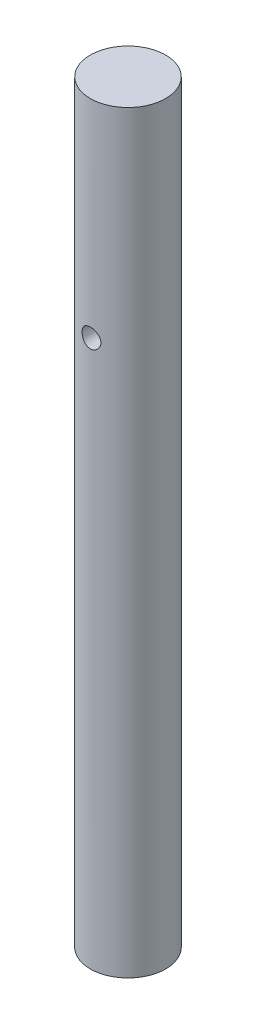
ISO-10303-21;
HEADER;
FILE_DESCRIPTION(('STEP AP214'),'2;1');
FILE_NAME('part.step','',(''),(''),'','','');
FILE_SCHEMA(('AUTOMOTIVE_DESIGN { 1 0 10303 214 1 1 1 1 }'));
ENDSEC;
DATA;
#1=APPLICATION_CONTEXT('core data for automotive mechanical design processes');
#2=APPLICATION_PROTOCOL_DEFINITION('international standard','automotive_design',2000,#1);
#3=PRODUCT_CONTEXT('',#1,'mechanical');
#4=PRODUCT('Part','Part','',(#3));
#5=PRODUCT_RELATED_PRODUCT_CATEGORY('part','',(#4));
#6=PRODUCT_DEFINITION_FORMATION('','',#4);
#7=PRODUCT_DEFINITION_CONTEXT('part definition',#1,'design');
#8=PRODUCT_DEFINITION('design','',#6,#7);
#9=PRODUCT_DEFINITION_SHAPE('','',#8);
#10=(LENGTH_UNIT() NAMED_UNIT(*) SI_UNIT(.MILLI.,.METRE.));
#11=(NAMED_UNIT(*) PLANE_ANGLE_UNIT() SI_UNIT($,.RADIAN.));
#12=(NAMED_UNIT(*) SI_UNIT($,.STERADIAN.) SOLID_ANGLE_UNIT());
#13=UNCERTAINTY_MEASURE_WITH_UNIT(LENGTH_MEASURE(1.E-05),#10,'distance_accuracy_value','');
#14=(GEOMETRIC_REPRESENTATION_CONTEXT(3) GLOBAL_UNCERTAINTY_ASSIGNED_CONTEXT((#13)) GLOBAL_UNIT_ASSIGNED_CONTEXT((#10,
#11,#12)) REPRESENTATION_CONTEXT('',''));
#15=CARTESIAN_POINT('',(0.,0.,0.));
#16=DIRECTION('',(0.,0.,1.));
#17=DIRECTION('',(1.,0.,0.));
#18=AXIS2_PLACEMENT_3D('',#15,#16,#17);
#19=CARTESIAN_POINT('',(0.,800.,0.));
#20=DIRECTION('',(0.,-1.,0.));
#21=DIRECTION('',(0.,0.,-1.));
#22=AXIS2_PLACEMENT_3D('',#19,#20,#21);
#23=CYLINDRICAL_SURFACE('',#22,40.);
#24=CARTESIAN_POINT('',(0.,590.,-40.));
#25=CARTESIAN_POINT('',(-0.276276686131214,589.999998834029,-39.9999993474412));
#26=CARTESIAN_POINT('',(-0.552576783631187,589.988541017278,-39.9971305425548));
#27=CARTESIAN_POINT('',(-1.10318148436562,589.942802754829,-39.9857330256128));
#28=CARTESIAN_POINT('',(-1.3774858563147,589.908519705193,-39.9772036677926));
#29=CARTESIAN_POINT('',(-1.92223360665172,589.817398561938,-39.9547164363919));
#30=CARTESIAN_POINT('',(-2.19267505387195,589.760549569592,-39.9407559397862));
#31=CARTESIAN_POINT('',(-2.72764291200184,589.624766293579,-39.907791142276));
#32=CARTESIAN_POINT('',(-2.99216918887111,589.545831509985,-39.8887867271994));
#33=CARTESIAN_POINT('',(-3.513145285565,589.366621628135,-39.8462801108945));
#34=CARTESIAN_POINT('',(-3.76960471060804,589.26637310496,-39.8227835143951));
#35=CARTESIAN_POINT('',(-4.27306727635454,589.045246902843,-39.7719112039748));
#36=CARTESIAN_POINT('',(-4.52007036697155,588.924369114656,-39.7445354695114));
#37=CARTESIAN_POINT('',(-5.00296312812478,588.662894261255,-39.6866412375216));
#38=CARTESIAN_POINT('',(-5.2388547021167,588.522300589999,-39.6561232811474));
#39=CARTESIAN_POINT('',(-5.69814612012699,588.222310872375,-39.5927379916157));
#40=CARTESIAN_POINT('',(-5.92154144861161,588.062908093187,-39.5598698188549));
#41=CARTESIAN_POINT('',(-6.35826451188653,587.723364111462,-39.4920522419941));
#42=CARTESIAN_POINT('',(-6.57133697514709,587.542899879583,-39.45707594235));
#43=CARTESIAN_POINT('',(-6.98169544574764,587.16476180459,-39.3865370660522));
#44=CARTESIAN_POINT('',(-7.1789742053463,586.967080146287,-39.3509742291619));
#45=CARTESIAN_POINT('',(-7.55636890063759,586.555850880297,-39.2802515251638));
#46=CARTESIAN_POINT('',(-7.73648287233055,586.342301461981,-39.2450917045731));
#47=CARTESIAN_POINT('',(-8.07823801416388,585.900843693481,-39.176172014405));
#48=CARTESIAN_POINT('',(-8.23988747905267,585.672941862732,-39.1424115205899));
#49=CARTESIAN_POINT('',(-8.54601878600914,585.20057500516,-39.0767252483031));
#50=CARTESIAN_POINT('',(-8.69019944369825,584.955909616723,-39.0448355320652));
#51=CARTESIAN_POINT('',(-8.95732951917686,584.45497352556,-38.9844200167823));
#52=CARTESIAN_POINT('',(-9.08028719545706,584.198707386251,-38.9558929106225));
#53=CARTESIAN_POINT('',(-9.30408470665821,583.676244662165,-38.9030492204288));
#54=CARTESIAN_POINT('',(-9.40492284026947,583.410047315376,-38.8787329602996));
#55=CARTESIAN_POINT('',(-9.58363487145947,582.869656183086,-38.8350668183171));
#56=CARTESIAN_POINT('',(-9.66150931910941,582.595462589298,-38.8157168175037));
#57=CARTESIAN_POINT('',(-9.79230027358011,582.046662445358,-38.7829255292181));
#58=CARTESIAN_POINT('',(-9.84568542228694,581.772174161763,-38.7693736587141));
#59=CARTESIAN_POINT('',(-9.92930040805544,581.219470103496,-38.7480433223281));
#60=CARTESIAN_POINT('',(-9.95953052583198,580.941254374053,-38.7402647864543));
#61=CARTESIAN_POINT('',(-9.99656649300492,580.383204676321,-38.7307245693961));
#62=CARTESIAN_POINT('',(-10.0033756681977,580.103370943442,-38.7289620339339));
#63=CARTESIAN_POINT('',(-9.99351800395715,579.544147192337,-38.7315068742112));
#64=CARTESIAN_POINT('',(-9.97685149095118,579.264757167995,-38.7358141655503));
#65=CARTESIAN_POINT('',(-9.92088090803786,578.715269768366,-38.7501861592384));
#66=CARTESIAN_POINT('',(-9.88213622905444,578.445111459601,-38.7601085512958));
#67=CARTESIAN_POINT('',(-9.78276403645947,577.909110496218,-38.7853084477115));
#68=CARTESIAN_POINT('',(-9.72213692994238,577.64326776141,-38.8005858524465));
#69=CARTESIAN_POINT('',(-9.57949942538268,577.117759628676,-38.8360474723497));
#70=CARTESIAN_POINT('',(-9.49749183020054,576.858093425907,-38.8562310443238));
#71=CARTESIAN_POINT('',(-9.31269309254722,576.346544686431,-38.9009354625423));
#72=CARTESIAN_POINT('',(-9.20989415752297,576.094665109064,-38.9254579345653));
#73=CARTESIAN_POINT('',(-8.98318087798946,575.597987061574,-38.9784060382958));
#74=CARTESIAN_POINT('',(-8.85906808208162,575.353283055091,-39.0068678154364));
#75=CARTESIAN_POINT('',(-8.5913353971669,574.875155226747,-39.0667091387545));
#76=CARTESIAN_POINT('',(-8.44771463246079,574.641731911905,-39.0980888158946));
#77=CARTESIAN_POINT('',(-8.14193923712399,574.187619741245,-39.1629064792632));
#78=CARTESIAN_POINT('',(-7.9797822705792,573.9669324957,-39.196344724665));
#79=CARTESIAN_POINT('',(-7.63801932614909,573.539698331601,-39.2643733021678));
#80=CARTESIAN_POINT('',(-7.45841302952054,573.333151671468,-39.2989636553065));
#81=CARTESIAN_POINT('',(-7.07753342014241,572.929806375805,-39.3693672656826));
#82=CARTESIAN_POINT('',(-6.87578778904269,572.73345463454,-39.4051872340633));
#83=CARTESIAN_POINT('',(-6.45639557413324,572.35839703072,-39.4760709124524));
#84=CARTESIAN_POINT('',(-6.2387492495781,572.179690880572,-39.5111346347791));
#85=CARTESIAN_POINT('',(-5.78892992120892,571.841105955039,-39.579540756308));
#86=CARTESIAN_POINT('',(-5.55675333032781,571.681231856995,-39.6128827267264));
#87=CARTESIAN_POINT('',(-5.07955796537568,571.381564063413,-39.6768951897208));
#88=CARTESIAN_POINT('',(-4.83454420385178,571.241762608675,-39.7075667127597));
#89=CARTESIAN_POINT('',(-4.33232990172717,570.982736830804,-39.765500548439));
#90=CARTESIAN_POINT('',(-4.07508804682034,570.863589677737,-39.7927499750226));
#91=CARTESIAN_POINT('',(-3.55104953194878,570.647439944504,-39.842933142722));
#92=CARTESIAN_POINT('',(-3.28425281831394,570.550437488748,-39.8658668595916));
#93=CARTESIAN_POINT('',(-2.74306842511346,570.379392123101,-39.9067562557545));
#94=CARTESIAN_POINT('',(-2.46868193424792,570.305345639808,-39.9247127097788));
#95=CARTESIAN_POINT('',(-1.91431246833759,570.180829515556,-39.9551305553882));
#96=CARTESIAN_POINT('',(-1.63432963144583,570.130359293334,-39.9675920824478));
#97=CARTESIAN_POINT('',(-1.07810473910737,570.054425527534,-39.9864118920525));
#98=CARTESIAN_POINT('',(-0.80195044945145,570.028354803981,-39.9929182716286));
#99=CARTESIAN_POINT('',(-0.248356982178854,569.999242879343,-40.0001867706141));
#100=CARTESIAN_POINT('',(0.0290821734369617,569.996201285376,-40.00094898802));
#101=CARTESIAN_POINT('',(0.583185768536804,570.013172712232,-39.9967080274712));
#102=CARTESIAN_POINT('',(0.859850270347678,570.033183821545,-39.991705327538));
#103=CARTESIAN_POINT('',(1.41040357408712,570.096085253755,-39.9760753561965));
#104=CARTESIAN_POINT('',(1.6842923868641,570.138975487195,-39.9654481067795));
#105=CARTESIAN_POINT('',(2.22327800001193,570.246465877286,-39.9390630903775));
#106=CARTESIAN_POINT('',(2.48844496615141,570.31073407719,-39.9233838802729));
#107=CARTESIAN_POINT('',(3.01234098850958,570.460606222222,-39.8872755198411));
#108=CARTESIAN_POINT('',(3.27107012780193,570.54620989188,-39.8668464308415));
#109=CARTESIAN_POINT('',(3.78033449341554,570.738082991647,-39.8217832029462));
#110=CARTESIAN_POINT('',(4.03087057538308,570.844350255639,-39.7971495048429));
#111=CARTESIAN_POINT('',(4.52223860683232,571.076813406541,-39.7443134144047));
#112=CARTESIAN_POINT('',(4.76306687714373,571.20301676155,-39.7161096855189));
#113=CARTESIAN_POINT('',(5.23752187646098,571.476814439144,-39.6563555782416));
#114=CARTESIAN_POINT('',(5.47094820846407,571.624745122626,-39.624755177931));
#115=CARTESIAN_POINT('',(5.92457828206947,571.939258527777,-39.5594728981749));
#116=CARTESIAN_POINT('',(6.14478145192343,572.105842055074,-39.5257909288532));
#117=CARTESIAN_POINT('',(6.57058731767183,572.456561077056,-39.4572414078492));
#118=CARTESIAN_POINT('',(6.77618804792628,572.640698926949,-39.4223736974844));
#119=CARTESIAN_POINT('',(7.1714528064819,573.025309493713,-39.352389485896));
#120=CARTESIAN_POINT('',(7.36111662432895,573.225782426227,-39.3172729813935));
#121=CARTESIAN_POINT('',(7.72774540600509,573.646906787547,-39.2468808270322));
#122=CARTESIAN_POINT('',(7.9042831534458,573.86793331146,-39.2116225166925));
#123=CARTESIAN_POINT('',(8.23811583861657,574.324316912182,-39.142847392759));
#124=CARTESIAN_POINT('',(8.39541126484785,574.559673624966,-39.1093305349678));
#125=CARTESIAN_POINT('',(8.68966091610267,575.043196551169,-39.0450059331012));
#126=CARTESIAN_POINT('',(8.82661122584507,575.291365217811,-39.0141987109411));
#127=CARTESIAN_POINT('',(9.07904857587192,575.798677033682,-38.9562273945278));
#128=CARTESIAN_POINT('',(9.1945442102564,576.057815737343,-38.9290618427496));
#129=CARTESIAN_POINT('',(9.4026163823082,576.58381347658,-38.879328567111));
#130=CARTESIAN_POINT('',(9.49532212114794,576.850618939403,-38.8567350588003));
#131=CARTESIAN_POINT('',(9.65791512678122,577.39147320057,-38.8166419949047));
#132=CARTESIAN_POINT('',(9.72780242555451,577.665521988763,-38.7991424321806));
#133=CARTESIAN_POINT('',(9.8441460590741,578.218796716723,-38.7697871241357));
#134=CARTESIAN_POINT('',(9.89060669326285,578.498021696757,-38.7579303432304));
#135=CARTESIAN_POINT('',(9.9597017636605,579.059591322185,-38.740232565125));
#136=CARTESIAN_POINT('',(9.9823367731033,579.341935892359,-38.7343914231915));
#137=CARTESIAN_POINT('',(10.0032722204452,579.899447548998,-38.7289898198564));
#138=CARTESIAN_POINT('',(10.0022536208647,580.174587591908,-38.7292536033208));
#139=CARTESIAN_POINT('',(9.97755972226951,580.723776907411,-38.7356226876572));
#140=CARTESIAN_POINT('',(9.9538848817057,580.997826201963,-38.7417278703279));
#141=CARTESIAN_POINT('',(9.8840824840973,581.542852997241,-38.7595950267271));
#142=CARTESIAN_POINT('',(9.83795552407143,581.81383057945,-38.771356850041));
#143=CARTESIAN_POINT('',(9.72363550707294,582.350801016534,-38.8001853309248));
#144=CARTESIAN_POINT('',(9.65544233948358,582.616793846414,-38.8172520150877));
#145=CARTESIAN_POINT('',(9.49803119722785,583.140328204053,-38.8560667748234));
#146=CARTESIAN_POINT('',(9.4089455651017,583.397911755833,-38.8777853112568));
#147=CARTESIAN_POINT('',(9.21017526998103,583.904713754185,-38.9253530530372));
#148=CARTESIAN_POINT('',(9.10048316605145,584.1539291406,-38.9512037499907));
#149=CARTESIAN_POINT('',(8.86133636008451,584.64226545205,-39.0063041604206));
#150=CARTESIAN_POINT('',(8.7318834597438,584.881387294832,-39.0355535639609));
#151=CARTESIAN_POINT('',(8.45410693455427,585.348066951001,-39.0966532023658));
#152=CARTESIAN_POINT('',(8.3057824034957,585.575624208325,-39.1285035621011));
#153=CARTESIAN_POINT('',(7.98715019319338,586.023530819321,-39.1948030871517));
#154=CARTESIAN_POINT('',(7.81637004459896,586.243537368254,-39.2292983680228));
#155=CARTESIAN_POINT('',(7.45713945647239,586.668468963869,-39.2991672194456));
#156=CARTESIAN_POINT('',(7.26868873998238,586.873393774077,-39.3345408037568));
#157=CARTESIAN_POINT('',(6.87530741513618,587.266881073601,-39.4052037523679));
#158=CARTESIAN_POINT('',(6.67037284045594,587.455439602054,-39.4404930942815));
#159=CARTESIAN_POINT('',(6.24539503784921,587.814889147314,-39.5100163411835));
#160=CARTESIAN_POINT('',(6.02535212792859,587.985780535795,-39.5442502683646));
#161=CARTESIAN_POINT('',(5.56740359032032,588.311705186542,-39.6113435460404));
#162=CARTESIAN_POINT('',(5.32924418986217,588.466389716296,-39.6441661227826));
#163=CARTESIAN_POINT('',(4.8404265151646,588.755044537687,-39.7068124330665));
#164=CARTESIAN_POINT('',(4.58977286613402,588.88902242044,-39.7366372641816));
#165=CARTESIAN_POINT('',(4.07773321835856,589.135248391094,-39.7924413064267));
#166=CARTESIAN_POINT('',(3.81635191156582,589.247505858633,-39.8184221763682));
#167=CARTESIAN_POINT('',(3.28463135766318,589.449446743792,-39.8658048489492));
#168=CARTESIAN_POINT('',(3.01429346885352,589.539133566764,-39.8872073422793));
#169=CARTESIAN_POINT('',(2.51829671794581,589.68047406555,-39.9212703038143));
#170=CARTESIAN_POINT('',(2.29382401207507,589.736110394683,-39.9348181936603));
#171=CARTESIAN_POINT('',(1.84138358325462,589.83172183439,-39.9582356855493));
#172=CARTESIAN_POINT('',(1.61341610527136,589.871698037494,-39.9681055441881));
#173=CARTESIAN_POINT('',(1.15510194680524,589.935757826292,-39.9839757782934));
#174=CARTESIAN_POINT('',(0.92475503565459,589.9598398562,-39.9899757749611));
#175=CARTESIAN_POINT('',(0.462944023658243,589.991959343887,-39.9979876402783));
#176=CARTESIAN_POINT('',(0.231480229261548,590.000000976917,-40.0000005467506));
#177=CARTESIAN_POINT('',(0.,590.,-40.));
#178=B_SPLINE_CURVE_WITH_KNOTS('',3,(#24,#25,#26,#27,#28,#29,#30,#31,#32,#33,#34,#35,#36,#37,
#38,#39,#40,#41,#42,#43,#44,#45,#46,#47,#48,#49,#50,#51,#52,#53,#54,#55,#56,#57,#58,#59,#60,#61,
#62,#63,#64,#65,#66,#67,#68,#69,#70,#71,#72,#73,#74,#75,#76,#77,#78,#79,#80,#81,#82,#83,#84,#85,
#86,#87,#88,#89,#90,#91,#92,#93,#94,#95,#96,#97,#98,#99,#100,#101,#102,#103,#104,#105,#106,#107,
#108,#109,#110,#111,#112,#113,#114,#115,#116,#117,#118,#119,#120,#121,#122,#123,#124,#125,#126,
#127,#128,#129,#130,#131,#132,#133,#134,#135,#136,#137,#138,#139,#140,#141,#142,#143,#144,#145,
#146,#147,#148,#149,#150,#151,#152,#153,#154,#155,#156,#157,#158,#159,#160,#161,#162,#163,#164,
#165,#166,#167,#168,#169,#170,#171,#172,#173,#174,#175,#176,#177),.UNSPECIFIED.,.T.,.F.,(4,2,2,
2,2,2,2,2,2,2,2,2,2,2,2,2,2,2,2,2,2,2,2,2,2,2,2,2,2,2,2,2,2,2,2,2,2,2,2,2,2,2,2,2,2,2,2,2,2,2,2,
2,2,2,2,2,2,2,2,2,2,2,2,2,2,2,2,2,2,2,2,2,2,2,2,2,4),(0.,0.828619089346032,1.65733272509385,
2.48644709461138,3.31558023322881,4.14368556550287,4.97179528331478,5.7997626222109,
6.62802724066698,7.47127713116493,8.31491179752409,9.15864287718403,10.0019934272019,
10.8582731380176,11.7142188901354,12.5702304536774,13.4262215106876,14.2650679436647,
15.103904206912,15.9426213496822,16.7813268302768,17.5996711950355,18.4180003363331,
19.2362222532303,20.0547514082784,20.8813618760701,21.7080094621043,22.5347613365454,
23.3615283159286,24.2119083751324,25.0622745723146,25.9128515327318,26.7630988071572,
27.6164573976883,28.4698207823289,29.3230512628312,30.1762607061874,31.0076247471077,
31.8389746047657,32.6702555326213,33.5015332102711,34.320462576117,35.1393813690201,
35.9582143627931,36.7773548236265,37.6108625247906,38.4444062395819,39.2780619461831,
40.1117286598548,40.9659053768096,41.820060404437,42.6743795961244,43.528355831706,
44.3773728438563,45.2263886661149,46.0752486136645,46.9240881375557,47.7485215778695,
48.5729383360593,49.3973331735862,50.2217321438249,51.0410436886271,51.8606516550368,
52.6801849380245,53.4997575896049,54.3407066639188,55.1816689209666,56.0228341380648,
56.8639816554285,57.7205715620531,58.5768466916347,59.432751222229,60.2885265404585,
60.9829517481762,61.6773285006459,62.3717732114253,63.0660371374129),.UNSPECIFIED.);
#179=CARTESIAN_POINT('',(0.,590.,-40.));
#180=VERTEX_POINT('',#179);
#181=EDGE_CURVE('E43',#180,#180,#178,.T.);
#182=ORIENTED_EDGE('',*,*,#181,.T.);
#183=EDGE_LOOP('',(#182));
#184=FACE_BOUND('',#183,.T.);
#185=CARTESIAN_POINT('',(10.,580.,38.7298334620742));
#186=CARTESIAN_POINT('',(9.99999882442997,579.723875269621,38.7298341899213));
#187=CARTESIAN_POINT('',(9.98855350815828,579.44772705279,38.7327944608192));
#188=CARTESIAN_POINT('',(9.94286631560048,578.897430412984,38.7445474128788));
#189=CARTESIAN_POINT('',(9.90862182549979,578.623282222945,38.7533407627742));
#190=CARTESIAN_POINT('',(9.81760607269129,578.07884984096,38.7764982213639));
#191=CARTESIAN_POINT('',(9.76082365272191,577.808567631604,38.7908650891136));
#192=CARTESIAN_POINT('',(9.62520453680396,577.273921714095,38.8247384391517));
#193=CARTESIAN_POINT('',(9.54636729901085,577.009558151524,38.8442450477129));
#194=CARTESIAN_POINT('',(9.36739293650582,576.48892864896,38.887792580226));
#195=CARTESIAN_POINT('',(9.26728433512593,576.232652387848,38.9118274273004));
#196=CARTESIAN_POINT('',(9.04647193519077,575.729541240295,38.963754954298));
#197=CARTESIAN_POINT('',(8.92576802777873,575.482706403765,38.9916476546118));
#198=CARTESIAN_POINT('',(8.66466792990956,575.000121599239,39.0504984131922));
#199=CARTESIAN_POINT('',(8.52427496956356,574.764369821452,39.0814559684059));
#200=CARTESIAN_POINT('',(8.22470570587664,574.305321566924,39.1455959147743));
#201=CARTESIAN_POINT('',(8.06552267426114,574.082029594148,39.1787791010265));
#202=CARTESIAN_POINT('',(7.72620281306206,573.645177958877,39.2471185148684));
#203=CARTESIAN_POINT('',(7.54571867677103,573.431892030132,39.2823005636594));
#204=CARTESIAN_POINT('',(7.1674955643557,573.021103625271,39.3530688746244));
#205=CARTESIAN_POINT('',(6.96974874819936,572.823608399506,39.3886553140078));
#206=CARTESIAN_POINT('',(6.55834550870102,572.445788565421,39.4592404464116));
#207=CARTESIAN_POINT('',(6.34468754181435,572.265465626867,39.4942390820045));
#208=CARTESIAN_POINT('',(5.90296918562836,571.923307200566,39.5626701967293));
#209=CARTESIAN_POINT('',(5.67491535983268,571.76146338083,39.5961033776605));
#210=CARTESIAN_POINT('',(5.20241798527374,571.455103256092,39.6609696857763));
#211=CARTESIAN_POINT('',(4.95778544729489,571.310870624242,39.6923669990285));
#212=CARTESIAN_POINT('',(4.45690914862996,571.043633472307,39.7517235658766));
#213=CARTESIAN_POINT('',(4.200669952289,570.920620697415,39.7796841551814));
#214=CARTESIAN_POINT('',(3.67826123228684,570.696712374437,39.8313856998777));
#215=CARTESIAN_POINT('',(3.41209084633901,570.595818752124,39.8551262878265));
#216=CARTESIAN_POINT('',(2.87176268956707,570.416996497642,39.8976992717744));
#217=CARTESIAN_POINT('',(2.59760510439595,570.339067332158,39.9165317817549));
#218=CARTESIAN_POINT('',(2.04895085371045,570.208180909796,39.9484139035388));
#219=CARTESIAN_POINT('',(1.77457355161674,570.154749784061,39.9615729295541));
#220=CARTESIAN_POINT('',(1.22210094355825,570.071026034696,39.9822820060831));
#221=CARTESIAN_POINT('',(0.944005683045228,570.040733128466,39.9898321251015));
#222=CARTESIAN_POINT('',(0.386193892504603,570.003551672863,39.9991081672612));
#223=CARTESIAN_POINT('',(0.106477575801441,569.996660111011,40.0008348400605));
#224=CARTESIAN_POINT('',(-0.452521768391034,570.006333777652,39.998416740294));
#225=CARTESIAN_POINT('',(-0.731804801218185,570.022898714838,39.9942720406449));
#226=CARTESIAN_POINT('',(-1.28167192331624,570.078710650796,39.9803861278034));
#227=CARTESIAN_POINT('',(-1.55231139511287,570.117445361854,39.9707713435709));
#228=CARTESIAN_POINT('',(-2.08927819575381,570.216878314874,39.9463033354469));
#229=CARTESIAN_POINT('',(-2.35560559929166,570.277576175965,39.9314502023955));
#230=CARTESIAN_POINT('',(-2.88207226755678,570.420436087917,39.8969077325925));
#231=CARTESIAN_POINT('',(-3.14221243703709,570.502594979235,39.8772191077585));
#232=CARTESIAN_POINT('',(-3.65468922534325,570.687776427834,39.8335212464006));
#233=CARTESIAN_POINT('',(-3.90702288413571,570.790806789946,39.8095103939667));
#234=CARTESIAN_POINT('',(-4.40431534757042,571.0179408462,39.7575786675424));
#235=CARTESIAN_POINT('',(-4.64918953968527,571.142222289025,39.7296251936964));
#236=CARTESIAN_POINT('',(-5.1276299458178,571.410319421921,39.6707136012489));
#237=CARTESIAN_POINT('',(-5.36119566090551,571.554135972819,39.6397553502575));
#238=CARTESIAN_POINT('',(-5.81555504064865,571.860320811557,39.5756487313005));
#239=CARTESIAN_POINT('',(-6.03634710089039,572.022691422263,39.5425000893299));
#240=CARTESIAN_POINT('',(-6.46374754042438,572.364889355903,39.4748880854212));
#241=CARTESIAN_POINT('',(-6.67035566703926,572.544716989685,39.4404247000789));
#242=CARTESIAN_POINT('',(-7.07349089831619,572.925770408818,39.3701501734565));
#243=CARTESIAN_POINT('',(-7.26959292932934,573.127444095085,39.3343278217393));
#244=CARTESIAN_POINT('',(-7.64415900384798,573.546641179253,39.2632548591757));
#245=CARTESIAN_POINT('',(-7.82262331948686,573.764164332523,39.228004239515));
#246=CARTESIAN_POINT('',(-8.1607456998875,574.213692980132,39.1590604771079));
#247=CARTESIAN_POINT('',(-8.32039882751899,574.445702252121,39.1253677446435));
#248=CARTESIAN_POINT('',(-8.61965464411434,574.922525158569,39.060529886451));
#249=CARTESIAN_POINT('',(-8.75926505153293,575.167333814169,39.0293837820158));
#250=CARTESIAN_POINT('',(-9.01813008771381,575.669466740345,38.9703868755207));
#251=CARTESIAN_POINT('',(-9.13727778907712,575.926848234477,38.9425536036319));
#252=CARTESIAN_POINT('',(-9.3534096608626,576.451178423362,38.8912082072346));
#253=CARTESIAN_POINT('',(-9.45039369101393,576.718127178653,38.8676961100745));
#254=CARTESIAN_POINT('',(-9.62137978988926,577.259626039938,38.8257235359302));
#255=CARTESIAN_POINT('',(-9.6953858891352,577.534174803615,38.8072621730724));
#256=CARTESIAN_POINT('',(-9.81979727188805,578.088882634275,38.7759681424773));
#257=CARTESIAN_POINT('',(-9.87020317804405,578.369041553042,38.7631353262415));
#258=CARTESIAN_POINT('',(-9.94595070620549,578.925389827174,38.7437678916113));
#259=CARTESIAN_POINT('',(-9.97191943788913,579.20148845672,38.7370758084013));
#260=CARTESIAN_POINT('',(-10.0008373658099,579.754966786012,38.7296201690535));
#261=CARTESIAN_POINT('',(-10.0037869656029,580.032346463215,38.7288565089826));
#262=CARTESIAN_POINT('',(-9.98664204170718,580.586319928274,38.7332810041534));
#263=CARTESIAN_POINT('',(-9.96654947524488,580.862913780878,38.7384686538844));
#264=CARTESIAN_POINT('',(-9.90349851182773,581.413309624554,38.7546355102655));
#265=CARTESIAN_POINT('',(-9.86054021553218,581.687111627911,38.7656146914202));
#266=CARTESIAN_POINT('',(-9.75302617959886,582.225436670251,38.792802095148));
#267=CARTESIAN_POINT('',(-9.68884045543288,582.490038288319,38.808920572734));
#268=CARTESIAN_POINT('',(-9.53919991763378,583.012912140479,38.8459727915572));
#269=CARTESIAN_POINT('',(-9.45373745454552,583.271182061423,38.8669082644045));
#270=CARTESIAN_POINT('',(-9.26222456918992,583.779545952517,38.9129912310831));
#271=CARTESIAN_POINT('',(-9.156176456258,584.029640836083,38.9381382524119));
#272=CARTESIAN_POINT('',(-8.9242616719413,584.520081796427,38.9919442389091));
#273=CARTESIAN_POINT('',(-8.79839403460798,584.760427397335,39.020603375233));
#274=CARTESIAN_POINT('',(-8.52507025703206,585.234451946238,39.0812377810118));
#275=CARTESIAN_POINT('',(-8.37723937262532,585.467907932585,39.1132670320869));
#276=CARTESIAN_POINT('',(-8.06292122077331,585.92161004068,39.1792684975873));
#277=CARTESIAN_POINT('',(-7.8964337599021,586.141856025434,39.213240732155));
#278=CARTESIAN_POINT('',(-7.54588651811454,586.567775929618,39.2822033680952));
#279=CARTESIAN_POINT('',(-7.36182400287637,586.773447572877,39.3171939273078));
#280=CARTESIAN_POINT('',(-6.97734499923084,587.16887046714,39.3872419853854));
#281=CARTESIAN_POINT('',(-6.77692868956994,587.358621892105,39.4222994835148));
#282=CARTESIAN_POINT('',(-6.35575426200214,587.725564756481,39.492418194567));
#283=CARTESIAN_POINT('',(-6.13461012391737,587.902317714946,39.5274571209805));
#284=CARTESIAN_POINT('',(-5.67802548588014,588.23650628064,39.5956219392226));
#285=CARTESIAN_POINT('',(-5.44259023238082,588.393948913588,39.6287485244866));
#286=CARTESIAN_POINT('',(-4.95889198957682,588.688473853361,39.6921766318283));
#287=CARTESIAN_POINT('',(-4.71062694336362,588.8255528817,39.7224776987134));
#288=CARTESIAN_POINT('',(-4.20300973280715,589.078275792786,39.7793907145879));
#289=CARTESIAN_POINT('',(-3.9436577325089,589.193919992552,39.8060027181368));
#290=CARTESIAN_POINT('',(-3.41762467099819,589.40208833476,39.854599371261));
#291=CARTESIAN_POINT('',(-3.15101114925918,589.494775508058,39.8766164648642));
#292=CARTESIAN_POINT('',(-2.61056101580697,589.657359782472,39.9156405917383));
#293=CARTESIAN_POINT('',(-2.33672441895222,589.727256930464,39.9326476353145));
#294=CARTESIAN_POINT('',(-1.78388474605426,589.843654650577,39.9611605112158));
#295=CARTESIAN_POINT('',(-1.50488250857591,589.890158986238,39.9726672284434));
#296=CARTESIAN_POINT('',(-0.943766157460648,589.959378028779,39.9898497386379));
#297=CARTESIAN_POINT('',(-0.661652112184832,589.982093257219,39.9955256594407));
#298=CARTESIAN_POINT('',(-0.104112904575605,590.003242923547,40.0008096434568));
#299=CARTESIAN_POINT('',(0.171286648704951,590.002317857947,40.0005777695811));
#300=CARTESIAN_POINT('',(0.72100471728221,589.977767630316,39.9944459263858));
#301=CARTESIAN_POINT('',(0.995323253299014,589.95414290552,39.9885460662415));
#302=CARTESIAN_POINT('',(1.54089668345798,589.88439505555,39.9712412549094));
#303=CARTESIAN_POINT('',(1.81215168421024,589.838272715769,39.9598364958982));
#304=CARTESIAN_POINT('',(2.3496844415104,589.723913257753,39.9318346598787));
#305=CARTESIAN_POINT('',(2.6159621757557,589.655676040449,39.9152375596099));
#306=CARTESIAN_POINT('',(3.14021575704103,589.498081239422,39.8774088289047));
#307=CARTESIAN_POINT('',(3.39822973487922,589.408844031413,39.8562036638954));
#308=CARTESIAN_POINT('',(3.90587165349159,589.20969788033,39.8096616921238));
#309=CARTESIAN_POINT('',(4.15549652321266,589.099781462185,39.7843233917676));
#310=CARTESIAN_POINT('',(4.64461219621893,588.860120723733,39.7301915510436));
#311=CARTESIAN_POINT('',(4.88410403648992,588.730378438647,39.7013983654015));
#312=CARTESIAN_POINT('',(5.35147219645957,588.451966546248,39.6411058752873));
#313=CARTESIAN_POINT('',(5.57934796737113,588.303296045853,39.6096064431502));
#314=CARTESIAN_POINT('',(6.02736320395832,587.98425435481,39.5439423385718));
#315=CARTESIAN_POINT('',(6.24718667381966,587.81344870947,39.5097319017043));
#316=CARTESIAN_POINT('',(6.67174267648604,587.454205479761,39.4402602733644));
#317=CARTESIAN_POINT('',(6.87647499099677,587.265767640431,39.404999066703));
#318=CARTESIAN_POINT('',(7.26957571543624,586.872451816628,39.3343764033807));
#319=CARTESIAN_POINT('',(7.45793992681896,586.667569639827,39.2990149233869));
#320=CARTESIAN_POINT('',(7.81700480743321,586.242738774985,39.2291715027163));
#321=CARTESIAN_POINT('',(7.98770582400299,586.022790383356,39.1946895447542));
#322=CARTESIAN_POINT('',(8.31334837970532,585.564947074658,39.126927151647));
#323=CARTESIAN_POINT('',(8.46793100988814,585.326791501892,39.0936817514607));
#324=CARTESIAN_POINT('',(8.75638447022772,584.837998523206,39.0300851587657));
#325=CARTESIAN_POINT('',(8.89026288683362,584.587365733907,38.9997329077193));
#326=CARTESIAN_POINT('',(9.13629742054285,584.075377682436,38.942830069642));
#327=CARTESIAN_POINT('',(9.24846310997747,583.814027207159,38.9162778086895));
#328=CARTESIAN_POINT('',(9.45023169430972,583.282367132466,38.8677746224896));
#329=CARTESIAN_POINT('',(9.53983802902283,583.012058906036,38.8458229958303));
#330=CARTESIAN_POINT('',(9.68099536807506,582.516272906672,38.8108560703005));
#331=CARTESIAN_POINT('',(9.7365385871733,582.291985908195,38.7969358503791));
#332=CARTESIAN_POINT('',(9.83199198174686,581.839915757489,38.7728560236366));
#333=CARTESIAN_POINT('',(9.87190326833696,581.612132854945,38.7626961495336));
#334=CARTESIAN_POINT('',(9.93585968093077,581.154187254159,38.746351883518));
#335=CARTESIAN_POINT('',(9.959903386569,580.924024344746,38.7401678474984));
#336=CARTESIAN_POINT('',(9.99197195283625,580.462579578736,38.7319088669302));
#337=CARTESIAN_POINT('',(10.0000009847254,580.231298029244,38.7298328523873));
#338=CARTESIAN_POINT('',(10.,580.,38.7298334620742));
#339=B_SPLINE_CURVE_WITH_KNOTS('',3,(#185,#186,#187,#188,#189,#190,#191,#192,#193,#194,#195,
#196,#197,#198,#199,#200,#201,#202,#203,#204,#205,#206,#207,#208,#209,#210,#211,#212,#213,#214,
#215,#216,#217,#218,#219,#220,#221,#222,#223,#224,#225,#226,#227,#228,#229,#230,#231,#232,#233,
#234,#235,#236,#237,#238,#239,#240,#241,#242,#243,#244,#245,#246,#247,#248,#249,#250,#251,#252,
#253,#254,#255,#256,#257,#258,#259,#260,#261,#262,#263,#264,#265,#266,#267,#268,#269,#270,#271,
#272,#273,#274,#275,#276,#277,#278,#279,#280,#281,#282,#283,#284,#285,#286,#287,#288,#289,#290,
#291,#292,#293,#294,#295,#296,#297,#298,#299,#300,#301,#302,#303,#304,#305,#306,#307,#308,#309,
#310,#311,#312,#313,#314,#315,#316,#317,#318,#319,#320,#321,#322,#323,#324,#325,#326,#327,#328,
#329,#330,#331,#332,#333,#334,#335,#336,#337,#338),.UNSPECIFIED.,.T.,.F.,(4,2,2,2,2,2,2,2,2,2,2,
2,2,2,2,2,2,2,2,2,2,2,2,2,2,2,2,2,2,2,2,2,2,2,2,2,2,2,2,2,2,2,2,2,2,2,2,2,2,2,2,2,2,2,2,2,2,2,2,
2,2,2,2,2,2,2,2,2,2,2,2,2,2,2,2,2,4),(0.,0.828162825376978,1.65642061195399,2.48508893479632,
3.31377761821723,4.1413620257038,4.96895080753393,5.79640397677724,6.62415434115293,
7.46800303009643,8.31223697591952,9.15655292804189,10.0004866733415,10.8565959733453,
11.7123714806967,12.5682214654157,13.4240515727625,14.2625454893965,15.1010291648647,
15.9394048973841,16.7777702181964,17.5975029902135,18.4172215476144,19.2368194921193,
20.056724490713,20.8838566603857,21.7110252899347,22.5382975900666,23.3655846236837,
24.2152966903926,25.0649956447941,25.9149171143109,26.7645103958648,27.6184163805485,
28.4723277693369,29.3260892901699,30.1798282847551,31.0110078576626,31.84217285886,
32.6732672652382,33.5043580130106,34.3216649160701,35.1392660843285,35.9567755855605,
36.7743249422727,37.6078964412196,38.4414765831921,39.2751866252889,40.1088875561811,
40.9636530981616,41.8181067205346,42.6726977588944,43.5272761569089,44.3755994984591,
45.2239210950745,46.0721061662236,46.9202726411622,47.7454843682623,48.5706802006537,
49.3958472274469,50.2210179508398,51.0415691607351,51.8624175534056,52.6831817385655,
53.5039846638633,54.3444458716784,55.1849192344215,56.0256075526297,56.8662793359625,
57.722842795138,58.5790916443919,59.4349621414429,60.2907020575397,60.9845870835283,
61.6784227793473,62.3723205745283,63.0660376100851),.UNSPECIFIED.);
#340=CARTESIAN_POINT('',(10.,580.,38.7298334620742));
#341=VERTEX_POINT('',#340);
#342=EDGE_CURVE('E59',#341,#341,#339,.T.);
#343=ORIENTED_EDGE('',*,*,#342,.T.);
#344=EDGE_LOOP('',(#343));
#345=FACE_BOUND('',#344,.T.);
#346=CARTESIAN_POINT('',(0.,800.,0.));
#347=DIRECTION('',(0.,1.,0.));
#348=DIRECTION('',(0.,0.,1.));
#349=AXIS2_PLACEMENT_3D('',#346,#347,#348);
#350=CIRCLE('',#349,40.);
#351=CARTESIAN_POINT('',(0.,800.,40.));
#352=VERTEX_POINT('',#351);
#353=EDGE_CURVE('E10',#352,#352,#350,.T.);
#354=ORIENTED_EDGE('',*,*,#353,.F.);
#355=EDGE_LOOP('',(#354));
#356=FACE_BOUND('',#355,.T.);
#357=CARTESIAN_POINT('',(0.,0.,0.));
#358=DIRECTION('',(0.,1.,0.));
#359=DIRECTION('',(0.,0.,1.));
#360=AXIS2_PLACEMENT_3D('',#357,#358,#359);
#361=CIRCLE('',#360,40.);
#362=CARTESIAN_POINT('',(0.,0.,40.));
#363=VERTEX_POINT('',#362);
#364=EDGE_CURVE('E52',#363,#363,#361,.T.);
#365=ORIENTED_EDGE('',*,*,#364,.T.);
#366=EDGE_LOOP('',(#365));
#367=FACE_BOUND('',#366,.T.);
#368=ADVANCED_FACE('F39',(#184,#345,#356,#367),#23,.T.);
#369=CARTESIAN_POINT('',(0.,800.,0.));
#370=DIRECTION('',(0.,1.,0.));
#371=DIRECTION('',(0.,0.,1.));
#372=AXIS2_PLACEMENT_3D('',#369,#370,#371);
#373=PLANE('',#372);
#374=ORIENTED_EDGE('',*,*,#353,.T.);
#375=EDGE_LOOP('',(#374));
#376=FACE_BOUND('',#375,.T.);
#377=ADVANCED_FACE('F71',(#376),#373,.T.);
#378=CARTESIAN_POINT('',(0.,0.,0.));
#379=DIRECTION('',(0.,1.,0.));
#380=DIRECTION('',(0.,0.,1.));
#381=AXIS2_PLACEMENT_3D('',#378,#379,#380);
#382=PLANE('',#381);
#383=ORIENTED_EDGE('',*,*,#364,.F.);
#384=EDGE_LOOP('',(#383));
#385=FACE_BOUND('',#384,.T.);
#386=ADVANCED_FACE('F69',(#385),#382,.F.);
#387=CARTESIAN_POINT('',(0.,580.,-400.));
#388=DIRECTION('',(0.,0.,1.));
#389=DIRECTION('',(1.,0.,0.));
#390=AXIS2_PLACEMENT_3D('',#387,#388,#389);
#391=CYLINDRICAL_SURFACE('',#390,10.);
#392=ORIENTED_EDGE('',*,*,#342,.F.);
#393=EDGE_LOOP('',(#392));
#394=FACE_BOUND('',#393,.T.);
#395=ORIENTED_EDGE('',*,*,#181,.F.);
#396=EDGE_LOOP('',(#395));
#397=FACE_BOUND('',#396,.T.);
#398=ADVANCED_FACE('F65',(#394,#397),#391,.F.);
#399=CLOSED_SHELL('',(#368,#377,#386,#398));
#400=MANIFOLD_SOLID_BREP('B2',#399);
#401=ADVANCED_BREP_SHAPE_REPRESENTATION('',(#18,#400),#14);
#402=SHAPE_DEFINITION_REPRESENTATION(#9,#401);
ENDSEC;
END-ISO-10303-21;
